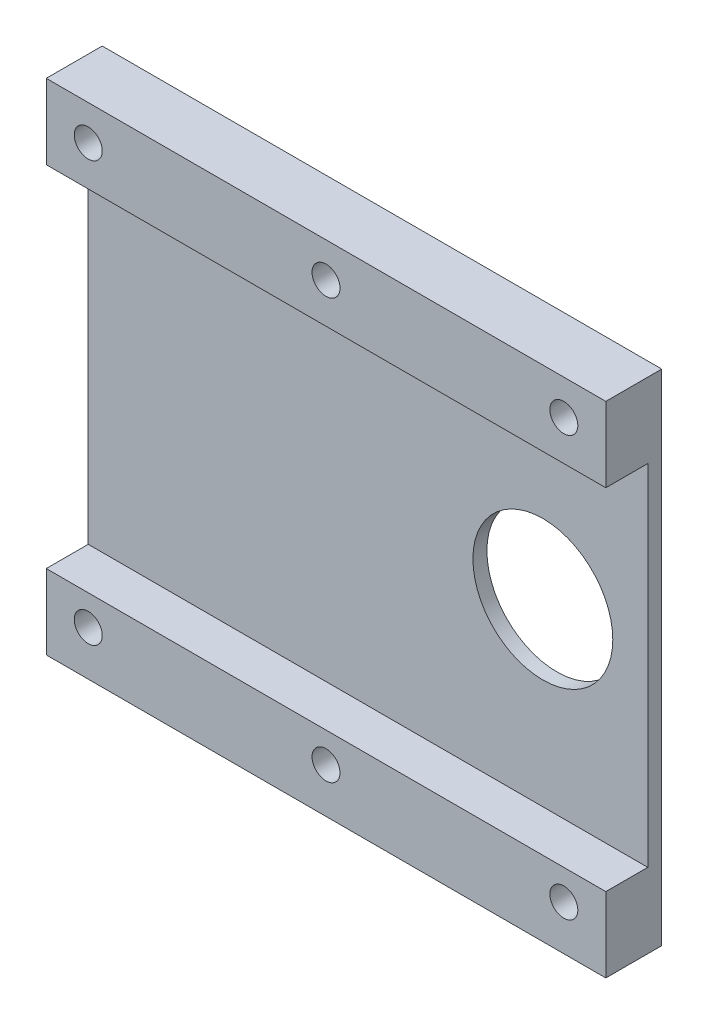
ISO-10303-21;
HEADER;
FILE_DESCRIPTION(('STEP AP214'),'2;1');
FILE_NAME('part.step','',(''),(''),'','','');
FILE_SCHEMA(('AUTOMOTIVE_DESIGN { 1 0 10303 214 1 1 1 1 }'));
ENDSEC;
DATA;
#1=APPLICATION_CONTEXT('core data for automotive mechanical design processes');
#2=APPLICATION_PROTOCOL_DEFINITION('international standard','automotive_design',2000,#1);
#3=PRODUCT_CONTEXT('',#1,'mechanical');
#4=PRODUCT('Part','Part','',(#3));
#5=PRODUCT_RELATED_PRODUCT_CATEGORY('part','',(#4));
#6=PRODUCT_DEFINITION_FORMATION('','',#4);
#7=PRODUCT_DEFINITION_CONTEXT('part definition',#1,'design');
#8=PRODUCT_DEFINITION('design','',#6,#7);
#9=PRODUCT_DEFINITION_SHAPE('','',#8);
#10=(LENGTH_UNIT() NAMED_UNIT(*) SI_UNIT(.MILLI.,.METRE.));
#11=(NAMED_UNIT(*) PLANE_ANGLE_UNIT() SI_UNIT($,.RADIAN.));
#12=(NAMED_UNIT(*) SI_UNIT($,.STERADIAN.) SOLID_ANGLE_UNIT());
#13=UNCERTAINTY_MEASURE_WITH_UNIT(LENGTH_MEASURE(1.E-05),#10,'distance_accuracy_value','');
#14=(GEOMETRIC_REPRESENTATION_CONTEXT(3) GLOBAL_UNCERTAINTY_ASSIGNED_CONTEXT((#13)) GLOBAL_UNIT_ASSIGNED_CONTEXT((#10,
#11,#12)) REPRESENTATION_CONTEXT('',''));
#15=CARTESIAN_POINT('',(0.,0.,0.));
#16=DIRECTION('',(0.,0.,1.));
#17=DIRECTION('',(1.,0.,0.));
#18=AXIS2_PLACEMENT_3D('',#15,#16,#17);
#19=CARTESIAN_POINT('',(0.,0.,4.));
#20=DIRECTION('',(0.,0.,1.));
#21=DIRECTION('',(1.,0.,0.));
#22=AXIS2_PLACEMENT_3D('',#19,#20,#21);
#23=PLANE('',#22);
#24=DIRECTION('',(1.,0.,0.));
#25=VECTOR('',#24,1.);
#26=CARTESIAN_POINT('',(-25.,-12.5,4.));
#27=LINE('',#26,#25);
#28=CARTESIAN_POINT('',(-20.,-12.5,4.));
#29=VERTEX_POINT('',#28);
#30=CARTESIAN_POINT('',(20.,-12.5,4.));
#31=VERTEX_POINT('',#30);
#32=EDGE_CURVE('E127',#29,#31,#27,.T.);
#33=ORIENTED_EDGE('',*,*,#32,.F.);
#34=DIRECTION('',(0.,-1.,0.));
#35=VECTOR('',#34,1.);
#36=CARTESIAN_POINT('',(-20.,17.85,4.));
#37=LINE('',#36,#35);
#38=CARTESIAN_POINT('',(-20.,-17.85,4.));
#39=VERTEX_POINT('',#38);
#40=EDGE_CURVE('E144',#29,#39,#37,.T.);
#41=ORIENTED_EDGE('',*,*,#40,.T.);
#42=DIRECTION('',(1.,0.,0.));
#43=VECTOR('',#42,1.);
#44=CARTESIAN_POINT('',(-20.,-17.85,4.));
#45=LINE('',#44,#43);
#46=CARTESIAN_POINT('',(20.,-17.85,4.));
#47=VERTEX_POINT('',#46);
#48=EDGE_CURVE('E62',#39,#47,#45,.T.);
#49=ORIENTED_EDGE('',*,*,#48,.T.);
#50=DIRECTION('',(0.,1.,0.));
#51=VECTOR('',#50,1.);
#52=CARTESIAN_POINT('',(20.,17.85,4.));
#53=LINE('',#52,#51);
#54=EDGE_CURVE('E134',#47,#31,#53,.T.);
#55=ORIENTED_EDGE('',*,*,#54,.T.);
#56=EDGE_LOOP('',(#33,#41,#49,#55));
#57=FACE_BOUND('',#56,.T.);
#58=CARTESIAN_POINT('',(17.,-14.65,4.));
#59=DIRECTION('',(0.,0.,1.));
#60=DIRECTION('',(1.,0.,0.));
#61=AXIS2_PLACEMENT_3D('',#58,#59,#60);
#62=CIRCLE('',#61,1.);
#63=CARTESIAN_POINT('',(18.,-14.65,4.));
#64=VERTEX_POINT('',#63);
#65=EDGE_CURVE('E183',#64,#64,#62,.T.);
#66=ORIENTED_EDGE('',*,*,#65,.F.);
#67=EDGE_LOOP('',(#66));
#68=FACE_BOUND('',#67,.T.);
#69=CARTESIAN_POINT('',(0.,-14.65,4.));
#70=DIRECTION('',(0.,0.,1.));
#71=DIRECTION('',(1.,0.,0.));
#72=AXIS2_PLACEMENT_3D('',#69,#70,#71);
#73=CIRCLE('',#72,1.);
#74=CARTESIAN_POINT('',(1.00000000000001,-14.65,4.));
#75=VERTEX_POINT('',#74);
#76=EDGE_CURVE('E195',#75,#75,#73,.T.);
#77=ORIENTED_EDGE('',*,*,#76,.F.);
#78=EDGE_LOOP('',(#77));
#79=FACE_BOUND('',#78,.T.);
#80=CARTESIAN_POINT('',(-17.,-14.65,4.));
#81=DIRECTION('',(0.,0.,1.));
#82=DIRECTION('',(1.,0.,0.));
#83=AXIS2_PLACEMENT_3D('',#80,#81,#82);
#84=CIRCLE('',#83,1.);
#85=CARTESIAN_POINT('',(-16.,-14.65,4.));
#86=VERTEX_POINT('',#85);
#87=EDGE_CURVE('E189',#86,#86,#84,.T.);
#88=ORIENTED_EDGE('',*,*,#87,.F.);
#89=EDGE_LOOP('',(#88));
#90=FACE_BOUND('',#89,.T.);
#91=ADVANCED_FACE('F37',(#57,#68,#79,#90),#23,.T.);
#92=DIRECTION('',(-1.,0.,0.));
#93=VECTOR('',#92,1.);
#94=CARTESIAN_POINT('',(-25.,12.5,4.));
#95=LINE('',#94,#93);
#96=CARTESIAN_POINT('',(20.,12.5,4.));
#97=VERTEX_POINT('',#96);
#98=CARTESIAN_POINT('',(-20.,12.5,4.));
#99=VERTEX_POINT('',#98);
#100=EDGE_CURVE('E115',#97,#99,#95,.T.);
#101=ORIENTED_EDGE('',*,*,#100,.F.);
#102=CARTESIAN_POINT('',(20.,17.85,4.));
#103=VERTEX_POINT('',#102);
#104=EDGE_CURVE('E91',#97,#103,#53,.T.);
#105=ORIENTED_EDGE('',*,*,#104,.T.);
#106=DIRECTION('',(-1.,0.,0.));
#107=VECTOR('',#106,1.);
#108=CARTESIAN_POINT('',(-20.,17.85,4.));
#109=LINE('',#108,#107);
#110=CARTESIAN_POINT('',(-20.,17.85,4.));
#111=VERTEX_POINT('',#110);
#112=EDGE_CURVE('E136',#103,#111,#109,.T.);
#113=ORIENTED_EDGE('',*,*,#112,.T.);
#114=EDGE_CURVE('E126',#111,#99,#37,.T.);
#115=ORIENTED_EDGE('',*,*,#114,.T.);
#116=EDGE_LOOP('',(#101,#105,#113,#115));
#117=FACE_BOUND('',#116,.T.);
#118=CARTESIAN_POINT('',(17.,15.35,4.));
#119=DIRECTION('',(0.,0.,1.));
#120=DIRECTION('',(1.,0.,0.));
#121=AXIS2_PLACEMENT_3D('',#118,#119,#120);
#122=CIRCLE('',#121,1.00000000000001);
#123=CARTESIAN_POINT('',(18.,15.35,4.));
#124=VERTEX_POINT('',#123);
#125=EDGE_CURVE('E201',#124,#124,#122,.T.);
#126=ORIENTED_EDGE('',*,*,#125,.F.);
#127=EDGE_LOOP('',(#126));
#128=FACE_BOUND('',#127,.T.);
#129=CARTESIAN_POINT('',(-17.,15.35,4.));
#130=DIRECTION('',(0.,0.,1.));
#131=DIRECTION('',(1.,0.,0.));
#132=AXIS2_PLACEMENT_3D('',#129,#130,#131);
#133=CIRCLE('',#132,1.);
#134=CARTESIAN_POINT('',(-16.,15.35,4.));
#135=VERTEX_POINT('',#134);
#136=EDGE_CURVE('E151',#135,#135,#133,.T.);
#137=ORIENTED_EDGE('',*,*,#136,.F.);
#138=EDGE_LOOP('',(#137));
#139=FACE_BOUND('',#138,.T.);
#140=CARTESIAN_POINT('',(0.,15.35,4.));
#141=DIRECTION('',(0.,0.,1.));
#142=DIRECTION('',(1.,0.,0.));
#143=AXIS2_PLACEMENT_3D('',#140,#141,#142);
#144=CIRCLE('',#143,1.);
#145=CARTESIAN_POINT('',(1.00000000000001,15.35,4.));
#146=VERTEX_POINT('',#145);
#147=EDGE_CURVE('E207',#146,#146,#144,.T.);
#148=ORIENTED_EDGE('',*,*,#147,.F.);
#149=EDGE_LOOP('',(#148));
#150=FACE_BOUND('',#149,.T.);
#151=ADVANCED_FACE('F123',(#117,#128,#139,#150),#23,.T.);
#152=CARTESIAN_POINT('',(0.,0.,0.));
#153=DIRECTION('',(0.,0.,1.));
#154=DIRECTION('',(1.,0.,0.));
#155=AXIS2_PLACEMENT_3D('',#152,#153,#154);
#156=PLANE('',#155);
#157=CARTESIAN_POINT('',(12.5,0.349999999999961,0.));
#158=DIRECTION('',(0.,0.,-1.));
#159=DIRECTION('',(-1.,0.,0.));
#160=AXIS2_PLACEMENT_3D('',#157,#158,#159);
#161=CIRCLE('',#160,5.);
#162=CARTESIAN_POINT('',(7.5,0.349999999999961,0.));
#163=VERTEX_POINT('',#162);
#164=EDGE_CURVE('E451',#163,#163,#161,.T.);
#165=ORIENTED_EDGE('',*,*,#164,.F.);
#166=EDGE_LOOP('',(#165));
#167=FACE_BOUND('',#166,.T.);
#168=DIRECTION('',(0.,1.,0.));
#169=VECTOR('',#168,1.);
#170=CARTESIAN_POINT('',(20.,17.85,0.));
#171=LINE('',#170,#169);
#172=CARTESIAN_POINT('',(20.,-17.85,0.));
#173=VERTEX_POINT('',#172);
#174=CARTESIAN_POINT('',(20.,17.85,0.));
#175=VERTEX_POINT('',#174);
#176=EDGE_CURVE('E148',#173,#175,#171,.T.);
#177=ORIENTED_EDGE('',*,*,#176,.F.);
#178=DIRECTION('',(1.,0.,0.));
#179=VECTOR('',#178,1.);
#180=CARTESIAN_POINT('',(-20.,-17.85,0.));
#181=LINE('',#180,#179);
#182=CARTESIAN_POINT('',(-20.,-17.85,0.));
#183=VERTEX_POINT('',#182);
#184=EDGE_CURVE('E83',#183,#173,#181,.T.);
#185=ORIENTED_EDGE('',*,*,#184,.F.);
#186=DIRECTION('',(0.,-1.,0.));
#187=VECTOR('',#186,1.);
#188=CARTESIAN_POINT('',(-20.,17.85,0.));
#189=LINE('',#188,#187);
#190=CARTESIAN_POINT('',(-20.,17.85,0.));
#191=VERTEX_POINT('',#190);
#192=EDGE_CURVE('E137',#191,#183,#189,.T.);
#193=ORIENTED_EDGE('',*,*,#192,.F.);
#194=DIRECTION('',(-1.,0.,0.));
#195=VECTOR('',#194,1.);
#196=CARTESIAN_POINT('',(-20.,17.85,0.));
#197=LINE('',#196,#195);
#198=EDGE_CURVE('E150',#175,#191,#197,.T.);
#199=ORIENTED_EDGE('',*,*,#198,.F.);
#200=EDGE_LOOP('',(#177,#185,#193,#199));
#201=FACE_BOUND('',#200,.T.);
#202=CARTESIAN_POINT('',(-17.,15.35,0.));
#203=DIRECTION('',(0.,0.,1.));
#204=DIRECTION('',(1.,0.,0.));
#205=AXIS2_PLACEMENT_3D('',#202,#203,#204);
#206=CIRCLE('',#205,1.);
#207=CARTESIAN_POINT('',(-16.,15.35,0.));
#208=VERTEX_POINT('',#207);
#209=EDGE_CURVE('E141',#208,#208,#206,.T.);
#210=ORIENTED_EDGE('',*,*,#209,.T.);
#211=EDGE_LOOP('',(#210));
#212=FACE_BOUND('',#211,.T.);
#213=CARTESIAN_POINT('',(0.,15.35,0.));
#214=DIRECTION('',(0.,0.,1.));
#215=DIRECTION('',(1.,0.,0.));
#216=AXIS2_PLACEMENT_3D('',#213,#214,#215);
#217=CIRCLE('',#216,1.);
#218=CARTESIAN_POINT('',(1.00000000000001,15.35,0.));
#219=VERTEX_POINT('',#218);
#220=EDGE_CURVE('E204',#219,#219,#217,.T.);
#221=ORIENTED_EDGE('',*,*,#220,.T.);
#222=EDGE_LOOP('',(#221));
#223=FACE_BOUND('',#222,.T.);
#224=CARTESIAN_POINT('',(17.,15.35,0.));
#225=DIRECTION('',(0.,0.,1.));
#226=DIRECTION('',(1.,0.,0.));
#227=AXIS2_PLACEMENT_3D('',#224,#225,#226);
#228=CIRCLE('',#227,1.00000000000001);
#229=CARTESIAN_POINT('',(18.,15.35,0.));
#230=VERTEX_POINT('',#229);
#231=EDGE_CURVE('E198',#230,#230,#228,.T.);
#232=ORIENTED_EDGE('',*,*,#231,.T.);
#233=EDGE_LOOP('',(#232));
#234=FACE_BOUND('',#233,.T.);
#235=CARTESIAN_POINT('',(0.,-14.65,0.));
#236=DIRECTION('',(0.,0.,1.));
#237=DIRECTION('',(1.,0.,0.));
#238=AXIS2_PLACEMENT_3D('',#235,#236,#237);
#239=CIRCLE('',#238,1.);
#240=CARTESIAN_POINT('',(1.00000000000001,-14.65,0.));
#241=VERTEX_POINT('',#240);
#242=EDGE_CURVE('E192',#241,#241,#239,.T.);
#243=ORIENTED_EDGE('',*,*,#242,.T.);
#244=EDGE_LOOP('',(#243));
#245=FACE_BOUND('',#244,.T.);
#246=CARTESIAN_POINT('',(-17.,-14.65,0.));
#247=DIRECTION('',(0.,0.,1.));
#248=DIRECTION('',(1.,0.,0.));
#249=AXIS2_PLACEMENT_3D('',#246,#247,#248);
#250=CIRCLE('',#249,1.);
#251=CARTESIAN_POINT('',(-16.,-14.65,0.));
#252=VERTEX_POINT('',#251);
#253=EDGE_CURVE('E186',#252,#252,#250,.T.);
#254=ORIENTED_EDGE('',*,*,#253,.T.);
#255=EDGE_LOOP('',(#254));
#256=FACE_BOUND('',#255,.T.);
#257=CARTESIAN_POINT('',(17.,-14.65,0.));
#258=DIRECTION('',(0.,0.,1.));
#259=DIRECTION('',(1.,0.,0.));
#260=AXIS2_PLACEMENT_3D('',#257,#258,#259);
#261=CIRCLE('',#260,1.);
#262=CARTESIAN_POINT('',(18.,-14.65,0.));
#263=VERTEX_POINT('',#262);
#264=EDGE_CURVE('E182',#263,#263,#261,.T.);
#265=ORIENTED_EDGE('',*,*,#264,.T.);
#266=EDGE_LOOP('',(#265));
#267=FACE_BOUND('',#266,.T.);
#268=ADVANCED_FACE('F217',(#167,#201,#212,#223,#234,#245,#256,#267),#156,.F.);
#269=CARTESIAN_POINT('',(20.,17.85,4.));
#270=DIRECTION('',(-1.,0.,0.));
#271=DIRECTION('',(0.,0.,1.));
#272=AXIS2_PLACEMENT_3D('',#269,#270,#271);
#273=PLANE('',#272);
#274=DIRECTION('',(0.,1.,0.));
#275=VECTOR('',#274,1.);
#276=CARTESIAN_POINT('',(20.,17.85,1.));
#277=LINE('',#276,#275);
#278=CARTESIAN_POINT('',(20.,-12.5,1.));
#279=VERTEX_POINT('',#278);
#280=CARTESIAN_POINT('',(20.,12.5,1.));
#281=VERTEX_POINT('',#280);
#282=EDGE_CURVE('E120',#279,#281,#277,.T.);
#283=ORIENTED_EDGE('',*,*,#282,.F.);
#284=DIRECTION('',(0.,0.,1.));
#285=VECTOR('',#284,1.);
#286=CARTESIAN_POINT('',(20.,-12.5,4.));
#287=LINE('',#286,#285);
#288=EDGE_CURVE('E119',#279,#31,#287,.T.);
#289=ORIENTED_EDGE('',*,*,#288,.T.);
#290=ORIENTED_EDGE('',*,*,#54,.F.);
#291=DIRECTION('',(0.,0.,-1.));
#292=VECTOR('',#291,1.);
#293=CARTESIAN_POINT('',(20.,-17.85,4.));
#294=LINE('',#293,#292);
#295=EDGE_CURVE('E147',#47,#173,#294,.T.);
#296=ORIENTED_EDGE('',*,*,#295,.T.);
#297=ORIENTED_EDGE('',*,*,#176,.T.);
#298=DIRECTION('',(0.,0.,-1.));
#299=VECTOR('',#298,1.);
#300=CARTESIAN_POINT('',(20.,17.85,4.));
#301=LINE('',#300,#299);
#302=EDGE_CURVE('E133',#103,#175,#301,.T.);
#303=ORIENTED_EDGE('',*,*,#302,.F.);
#304=ORIENTED_EDGE('',*,*,#104,.F.);
#305=DIRECTION('',(0.,0.,-1.));
#306=VECTOR('',#305,1.);
#307=CARTESIAN_POINT('',(20.,12.5,4.));
#308=LINE('',#307,#306);
#309=EDGE_CURVE('E113',#97,#281,#308,.T.);
#310=ORIENTED_EDGE('',*,*,#309,.T.);
#311=EDGE_LOOP('',(#283,#289,#290,#296,#297,#303,#304,#310));
#312=FACE_BOUND('',#311,.T.);
#313=ADVANCED_FACE('F39',(#312),#273,.F.);
#314=CARTESIAN_POINT('',(-20.,17.85,4.));
#315=DIRECTION('',(0.,-1.,0.));
#316=DIRECTION('',(1.,0.,0.));
#317=AXIS2_PLACEMENT_3D('',#314,#315,#316);
#318=PLANE('',#317);
#319=ORIENTED_EDGE('',*,*,#198,.T.);
#320=DIRECTION('',(0.,0.,-1.));
#321=VECTOR('',#320,1.);
#322=CARTESIAN_POINT('',(-20.,17.85,4.));
#323=LINE('',#322,#321);
#324=EDGE_CURVE('E157',#111,#191,#323,.T.);
#325=ORIENTED_EDGE('',*,*,#324,.F.);
#326=ORIENTED_EDGE('',*,*,#112,.F.);
#327=ORIENTED_EDGE('',*,*,#302,.T.);
#328=EDGE_LOOP('',(#319,#325,#326,#327));
#329=FACE_BOUND('',#328,.T.);
#330=ADVANCED_FACE('F245',(#329),#318,.F.);
#331=CARTESIAN_POINT('',(-20.,17.85,4.));
#332=DIRECTION('',(1.,0.,0.));
#333=DIRECTION('',(0.,0.,-1.));
#334=AXIS2_PLACEMENT_3D('',#331,#332,#333);
#335=PLANE('',#334);
#336=ORIENTED_EDGE('',*,*,#40,.F.);
#337=DIRECTION('',(0.,0.,-1.));
#338=VECTOR('',#337,1.);
#339=CARTESIAN_POINT('',(-20.,-12.5,4.));
#340=LINE('',#339,#338);
#341=CARTESIAN_POINT('',(-20.,-12.5,1.));
#342=VERTEX_POINT('',#341);
#343=EDGE_CURVE('E11',#29,#342,#340,.T.);
#344=ORIENTED_EDGE('',*,*,#343,.T.);
#345=DIRECTION('',(0.,-1.,0.));
#346=VECTOR('',#345,1.);
#347=CARTESIAN_POINT('',(-20.,17.85,1.));
#348=LINE('',#347,#346);
#349=CARTESIAN_POINT('',(-20.,12.5,1.));
#350=VERTEX_POINT('',#349);
#351=EDGE_CURVE('E161',#350,#342,#348,.T.);
#352=ORIENTED_EDGE('',*,*,#351,.F.);
#353=DIRECTION('',(0.,0.,1.));
#354=VECTOR('',#353,1.);
#355=CARTESIAN_POINT('',(-20.,12.5,4.));
#356=LINE('',#355,#354);
#357=EDGE_CURVE('E46',#350,#99,#356,.T.);
#358=ORIENTED_EDGE('',*,*,#357,.T.);
#359=ORIENTED_EDGE('',*,*,#114,.F.);
#360=ORIENTED_EDGE('',*,*,#324,.T.);
#361=ORIENTED_EDGE('',*,*,#192,.T.);
#362=DIRECTION('',(0.,0.,-1.));
#363=VECTOR('',#362,1.);
#364=CARTESIAN_POINT('',(-20.,-17.85,4.));
#365=LINE('',#364,#363);
#366=EDGE_CURVE('E155',#39,#183,#365,.T.);
#367=ORIENTED_EDGE('',*,*,#366,.F.);
#368=EDGE_LOOP('',(#336,#344,#352,#358,#359,#360,#361,#367));
#369=FACE_BOUND('',#368,.T.);
#370=ADVANCED_FACE('F166',(#369),#335,.F.);
#371=CARTESIAN_POINT('',(-20.,-17.85,4.));
#372=DIRECTION('',(0.,1.,0.));
#373=DIRECTION('',(-1.,0.,0.));
#374=AXIS2_PLACEMENT_3D('',#371,#372,#373);
#375=PLANE('',#374);
#376=CARTESIAN_POINT('',(-7.5,-17.85,2.));
#377=DIRECTION('',(0.,-1.,0.));
#378=DIRECTION('',(1.,0.,0.));
#379=AXIS2_PLACEMENT_3D('',#376,#377,#378);
#380=CIRCLE('',#379,1.);
#381=CARTESIAN_POINT('',(-6.5,-17.85,2.));
#382=VERTEX_POINT('',#381);
#383=EDGE_CURVE('E461',#382,#382,#380,.T.);
#384=ORIENTED_EDGE('',*,*,#383,.F.);
#385=EDGE_LOOP('',(#384));
#386=FACE_BOUND('',#385,.T.);
#387=CARTESIAN_POINT('',(7.5,-17.85,2.));
#388=DIRECTION('',(0.,-1.,0.));
#389=DIRECTION('',(1.,0.,0.));
#390=AXIS2_PLACEMENT_3D('',#387,#388,#389);
#391=CIRCLE('',#390,1.);
#392=CARTESIAN_POINT('',(8.5,-17.85,2.));
#393=VERTEX_POINT('',#392);
#394=EDGE_CURVE('E453',#393,#393,#391,.T.);
#395=ORIENTED_EDGE('',*,*,#394,.F.);
#396=EDGE_LOOP('',(#395));
#397=FACE_BOUND('',#396,.T.);
#398=ORIENTED_EDGE('',*,*,#184,.T.);
#399=ORIENTED_EDGE('',*,*,#295,.F.);
#400=ORIENTED_EDGE('',*,*,#48,.F.);
#401=ORIENTED_EDGE('',*,*,#366,.T.);
#402=EDGE_LOOP('',(#398,#399,#400,#401));
#403=FACE_BOUND('',#402,.T.);
#404=ADVANCED_FACE('F223',(#386,#397,#403),#375,.F.);
#405=CARTESIAN_POINT('',(-17.,15.35,4.));
#406=DIRECTION('',(0.,0.,-1.));
#407=DIRECTION('',(-1.,0.,0.));
#408=AXIS2_PLACEMENT_3D('',#405,#406,#407);
#409=CYLINDRICAL_SURFACE('',#408,1.);
#410=ORIENTED_EDGE('',*,*,#136,.T.);
#411=EDGE_LOOP('',(#410));
#412=FACE_BOUND('',#411,.T.);
#413=ORIENTED_EDGE('',*,*,#209,.F.);
#414=EDGE_LOOP('',(#413));
#415=FACE_BOUND('',#414,.T.);
#416=ADVANCED_FACE('F220',(#412,#415),#409,.F.);
#417=CARTESIAN_POINT('',(0.,15.35,4.));
#418=DIRECTION('',(0.,0.,-1.));
#419=DIRECTION('',(-1.,0.,0.));
#420=AXIS2_PLACEMENT_3D('',#417,#418,#419);
#421=CYLINDRICAL_SURFACE('',#420,1.);
#422=ORIENTED_EDGE('',*,*,#147,.T.);
#423=EDGE_LOOP('',(#422));
#424=FACE_BOUND('',#423,.T.);
#425=ORIENTED_EDGE('',*,*,#220,.F.);
#426=EDGE_LOOP('',(#425));
#427=FACE_BOUND('',#426,.T.);
#428=ADVANCED_FACE('F222',(#424,#427),#421,.F.);
#429=CARTESIAN_POINT('',(17.,15.35,4.));
#430=DIRECTION('',(0.,0.,-1.));
#431=DIRECTION('',(-1.,0.,0.));
#432=AXIS2_PLACEMENT_3D('',#429,#430,#431);
#433=CYLINDRICAL_SURFACE('',#432,1.00000000000001);
#434=ORIENTED_EDGE('',*,*,#125,.T.);
#435=EDGE_LOOP('',(#434));
#436=FACE_BOUND('',#435,.T.);
#437=ORIENTED_EDGE('',*,*,#231,.F.);
#438=EDGE_LOOP('',(#437));
#439=FACE_BOUND('',#438,.T.);
#440=ADVANCED_FACE('F229',(#436,#439),#433,.F.);
#441=CARTESIAN_POINT('',(0.,-14.65,4.));
#442=DIRECTION('',(0.,0.,-1.));
#443=DIRECTION('',(-1.,0.,0.));
#444=AXIS2_PLACEMENT_3D('',#441,#442,#443);
#445=CYLINDRICAL_SURFACE('',#444,1.);
#446=ORIENTED_EDGE('',*,*,#76,.T.);
#447=EDGE_LOOP('',(#446));
#448=FACE_BOUND('',#447,.T.);
#449=ORIENTED_EDGE('',*,*,#242,.F.);
#450=EDGE_LOOP('',(#449));
#451=FACE_BOUND('',#450,.T.);
#452=ADVANCED_FACE('F298',(#448,#451),#445,.F.);
#453=CARTESIAN_POINT('',(-17.,-14.65,4.));
#454=DIRECTION('',(0.,0.,-1.));
#455=DIRECTION('',(-1.,0.,0.));
#456=AXIS2_PLACEMENT_3D('',#453,#454,#455);
#457=CYLINDRICAL_SURFACE('',#456,1.);
#458=ORIENTED_EDGE('',*,*,#87,.T.);
#459=EDGE_LOOP('',(#458));
#460=FACE_BOUND('',#459,.T.);
#461=ORIENTED_EDGE('',*,*,#253,.F.);
#462=EDGE_LOOP('',(#461));
#463=FACE_BOUND('',#462,.T.);
#464=ADVANCED_FACE('F287',(#460,#463),#457,.F.);
#465=CARTESIAN_POINT('',(17.,-14.65,4.));
#466=DIRECTION('',(0.,0.,-1.));
#467=DIRECTION('',(-1.,0.,0.));
#468=AXIS2_PLACEMENT_3D('',#465,#466,#467);
#469=CYLINDRICAL_SURFACE('',#468,1.);
#470=ORIENTED_EDGE('',*,*,#65,.T.);
#471=EDGE_LOOP('',(#470));
#472=FACE_BOUND('',#471,.T.);
#473=ORIENTED_EDGE('',*,*,#264,.F.);
#474=EDGE_LOOP('',(#473));
#475=FACE_BOUND('',#474,.T.);
#476=ADVANCED_FACE('F282',(#472,#475),#469,.F.);
#477=CARTESIAN_POINT('',(-25.,-12.5,1.));
#478=DIRECTION('',(0.,-1.,0.));
#479=DIRECTION('',(0.,0.,-1.));
#480=AXIS2_PLACEMENT_3D('',#477,#478,#479);
#481=PLANE('',#480);
#482=DIRECTION('',(1.,0.,0.));
#483=VECTOR('',#482,1.);
#484=CARTESIAN_POINT('',(-25.,-12.5,1.));
#485=LINE('',#484,#483);
#486=EDGE_CURVE('E170',#342,#279,#485,.T.);
#487=ORIENTED_EDGE('',*,*,#486,.F.);
#488=ORIENTED_EDGE('',*,*,#343,.F.);
#489=ORIENTED_EDGE('',*,*,#32,.T.);
#490=ORIENTED_EDGE('',*,*,#288,.F.);
#491=EDGE_LOOP('',(#487,#488,#489,#490));
#492=FACE_BOUND('',#491,.T.);
#493=ADVANCED_FACE('F172',(#492),#481,.F.);
#494=CARTESIAN_POINT('',(-25.,12.5,1.));
#495=DIRECTION('',(0.,1.,0.));
#496=DIRECTION('',(0.,0.,1.));
#497=AXIS2_PLACEMENT_3D('',#494,#495,#496);
#498=PLANE('',#497);
#499=ORIENTED_EDGE('',*,*,#100,.T.);
#500=ORIENTED_EDGE('',*,*,#357,.F.);
#501=DIRECTION('',(-1.,0.,0.));
#502=VECTOR('',#501,1.);
#503=CARTESIAN_POINT('',(-25.,12.5,1.));
#504=LINE('',#503,#502);
#505=EDGE_CURVE('E53',#281,#350,#504,.T.);
#506=ORIENTED_EDGE('',*,*,#505,.F.);
#507=ORIENTED_EDGE('',*,*,#309,.F.);
#508=EDGE_LOOP('',(#499,#500,#506,#507));
#509=FACE_BOUND('',#508,.T.);
#510=ADVANCED_FACE('F114',(#509),#498,.F.);
#511=CARTESIAN_POINT('',(0.,0.,1.));
#512=DIRECTION('',(0.,0.,1.));
#513=DIRECTION('',(1.,0.,0.));
#514=AXIS2_PLACEMENT_3D('',#511,#512,#513);
#515=PLANE('',#514);
#516=CARTESIAN_POINT('',(12.5,0.349999999999961,1.));
#517=DIRECTION('',(0.,0.,1.));
#518=DIRECTION('',(1.,0.,0.));
#519=AXIS2_PLACEMENT_3D('',#516,#517,#518);
#520=CIRCLE('',#519,5.);
#521=CARTESIAN_POINT('',(17.5,0.349999999999961,1.));
#522=VERTEX_POINT('',#521);
#523=EDGE_CURVE('E41',#522,#522,#520,.T.);
#524=ORIENTED_EDGE('',*,*,#523,.F.);
#525=EDGE_LOOP('',(#524));
#526=FACE_BOUND('',#525,.T.);
#527=ORIENTED_EDGE('',*,*,#282,.T.);
#528=ORIENTED_EDGE('',*,*,#505,.T.);
#529=ORIENTED_EDGE('',*,*,#351,.T.);
#530=ORIENTED_EDGE('',*,*,#486,.T.);
#531=EDGE_LOOP('',(#527,#528,#529,#530));
#532=FACE_BOUND('',#531,.T.);
#533=ADVANCED_FACE('F169',(#526,#532),#515,.T.);
#534=CARTESIAN_POINT('',(7.5,-14.85,2.));
#535=DIRECTION('',(0.,-1.,0.));
#536=DIRECTION('',(1.,0.,0.));
#537=AXIS2_PLACEMENT_3D('',#534,#535,#536);
#538=CYLINDRICAL_SURFACE('',#537,1.);
#539=CARTESIAN_POINT('',(7.5,-14.85,2.));
#540=DIRECTION('',(0.,-1.,0.));
#541=DIRECTION('',(1.,0.,0.));
#542=AXIS2_PLACEMENT_3D('',#539,#540,#541);
#543=CIRCLE('',#542,1.);
#544=CARTESIAN_POINT('',(8.5,-14.85,2.));
#545=VERTEX_POINT('',#544);
#546=EDGE_CURVE('E450',#545,#545,#543,.T.);
#547=ORIENTED_EDGE('',*,*,#546,.F.);
#548=EDGE_LOOP('',(#547));
#549=FACE_BOUND('',#548,.T.);
#550=ORIENTED_EDGE('',*,*,#394,.T.);
#551=EDGE_LOOP('',(#550));
#552=FACE_BOUND('',#551,.T.);
#553=ADVANCED_FACE('F365',(#549,#552),#538,.F.);
#554=CARTESIAN_POINT('',(7.5,-14.85,2.));
#555=DIRECTION('',(0.,-1.,0.));
#556=DIRECTION('',(1.,0.,0.));
#557=AXIS2_PLACEMENT_3D('',#554,#555,#556);
#558=PLANE('',#557);
#559=ORIENTED_EDGE('',*,*,#546,.T.);
#560=EDGE_LOOP('',(#559));
#561=FACE_BOUND('',#560,.T.);
#562=ADVANCED_FACE('F370',(#561),#558,.T.);
#563=CARTESIAN_POINT('',(-7.5,-14.85,2.));
#564=DIRECTION('',(0.,-1.,0.));
#565=DIRECTION('',(1.,0.,0.));
#566=AXIS2_PLACEMENT_3D('',#563,#564,#565);
#567=CYLINDRICAL_SURFACE('',#566,1.);
#568=CARTESIAN_POINT('',(-7.5,-14.85,2.));
#569=DIRECTION('',(0.,-1.,0.));
#570=DIRECTION('',(1.,0.,0.));
#571=AXIS2_PLACEMENT_3D('',#568,#569,#570);
#572=CIRCLE('',#571,1.);
#573=CARTESIAN_POINT('',(-6.5,-14.85,2.));
#574=VERTEX_POINT('',#573);
#575=EDGE_CURVE('E128',#574,#574,#572,.T.);
#576=ORIENTED_EDGE('',*,*,#575,.F.);
#577=EDGE_LOOP('',(#576));
#578=FACE_BOUND('',#577,.T.);
#579=ORIENTED_EDGE('',*,*,#383,.T.);
#580=EDGE_LOOP('',(#579));
#581=FACE_BOUND('',#580,.T.);
#582=ADVANCED_FACE('F383',(#578,#581),#567,.F.);
#583=CARTESIAN_POINT('',(-7.5,-14.85,2.));
#584=DIRECTION('',(0.,-1.,0.));
#585=DIRECTION('',(1.,0.,0.));
#586=AXIS2_PLACEMENT_3D('',#583,#584,#585);
#587=PLANE('',#586);
#588=ORIENTED_EDGE('',*,*,#575,.T.);
#589=EDGE_LOOP('',(#588));
#590=FACE_BOUND('',#589,.T.);
#591=ADVANCED_FACE('F393',(#590),#587,.T.);
#592=CARTESIAN_POINT('',(12.5,0.349999999999961,4.));
#593=DIRECTION('',(0.,0.,-1.));
#594=DIRECTION('',(-1.,0.,0.));
#595=AXIS2_PLACEMENT_3D('',#592,#593,#594);
#596=CYLINDRICAL_SURFACE('',#595,5.);
#597=ORIENTED_EDGE('',*,*,#523,.T.);
#598=EDGE_LOOP('',(#597));
#599=FACE_BOUND('',#598,.T.);
#600=ORIENTED_EDGE('',*,*,#164,.T.);
#601=EDGE_LOOP('',(#600));
#602=FACE_BOUND('',#601,.T.);
#603=ADVANCED_FACE('F403',(#599,#602),#596,.F.);
#604=CLOSED_SHELL('',(#91,#151,#268,#313,#330,#370,#404,#416,#428,#440,#452,#464,#476,#493,#510,
#533,#553,#562,#582,#591,#603));
#605=MANIFOLD_SOLID_BREP('B2',#604);
#606=ADVANCED_BREP_SHAPE_REPRESENTATION('',(#18,#605),#14);
#607=SHAPE_DEFINITION_REPRESENTATION(#9,#606);
ENDSEC;
END-ISO-10303-21;
